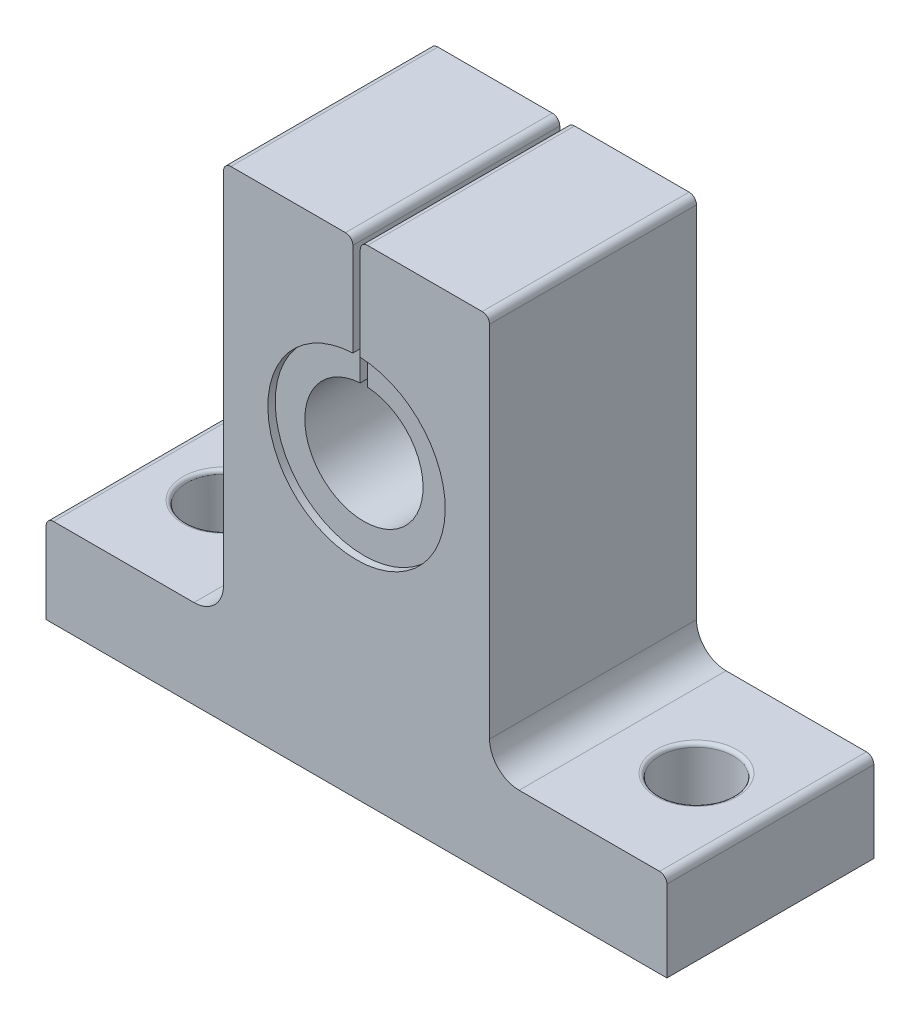
ISO-10303-21;
HEADER;
FILE_DESCRIPTION(('STEP AP214'),'2;1');
FILE_NAME('part.step','',(''),(''),'','','');
FILE_SCHEMA(('AUTOMOTIVE_DESIGN { 1 0 10303 214 1 1 1 1 }'));
ENDSEC;
DATA;
#1=APPLICATION_CONTEXT('core data for automotive mechanical design processes');
#2=APPLICATION_PROTOCOL_DEFINITION('international standard','automotive_design',2000,#1);
#3=PRODUCT_CONTEXT('',#1,'mechanical');
#4=PRODUCT('Part','Part','',(#3));
#5=PRODUCT_RELATED_PRODUCT_CATEGORY('part','',(#4));
#6=PRODUCT_DEFINITION_FORMATION('','',#4);
#7=PRODUCT_DEFINITION_CONTEXT('part definition',#1,'design');
#8=PRODUCT_DEFINITION('design','',#6,#7);
#9=PRODUCT_DEFINITION_SHAPE('','',#8);
#10=(LENGTH_UNIT() NAMED_UNIT(*) SI_UNIT(.MILLI.,.METRE.));
#11=(NAMED_UNIT(*) PLANE_ANGLE_UNIT() SI_UNIT($,.RADIAN.));
#12=(NAMED_UNIT(*) SI_UNIT($,.STERADIAN.) SOLID_ANGLE_UNIT());
#13=UNCERTAINTY_MEASURE_WITH_UNIT(LENGTH_MEASURE(1.E-05),#10,'distance_accuracy_value','');
#14=(GEOMETRIC_REPRESENTATION_CONTEXT(3) GLOBAL_UNCERTAINTY_ASSIGNED_CONTEXT((#13)) GLOBAL_UNIT_ASSIGNED_CONTEXT((#10,
#11,#12)) REPRESENTATION_CONTEXT('',''));
#15=CARTESIAN_POINT('',(0.,0.,0.));
#16=DIRECTION('',(0.,0.,1.));
#17=DIRECTION('',(1.,0.,0.));
#18=AXIS2_PLACEMENT_3D('',#15,#16,#17);
#19=CARTESIAN_POINT('',(-9.,32.8,14.));
#20=DIRECTION('',(0.,-1.,0.));
#21=DIRECTION('',(0.,0.,-1.));
#22=AXIS2_PLACEMENT_3D('',#19,#20,#21);
#23=PLANE('',#22);
#24=DIRECTION('',(-1.,0.,0.));
#25=VECTOR('',#24,1.);
#26=CARTESIAN_POINT('',(-9.,32.8,0.));
#27=LINE('',#26,#25);
#28=CARTESIAN_POINT('',(8.5,32.8,0.));
#29=VERTEX_POINT('',#28);
#30=CARTESIAN_POINT('',(0.750000000000004,32.8,0.));
#31=VERTEX_POINT('',#30);
#32=EDGE_CURVE('E441',#29,#31,#27,.T.);
#33=ORIENTED_EDGE('',*,*,#32,.T.);
#34=DIRECTION('',(0.,0.,-1.));
#35=VECTOR('',#34,1.);
#36=CARTESIAN_POINT('',(0.750000000000004,32.8,14.));
#37=LINE('',#36,#35);
#38=CARTESIAN_POINT('',(0.750000000000004,32.8,14.));
#39=VERTEX_POINT('',#38);
#40=EDGE_CURVE('E47',#31,#39,#37,.F.);
#41=ORIENTED_EDGE('',*,*,#40,.T.);
#42=DIRECTION('',(-1.,0.,0.));
#43=VECTOR('',#42,1.);
#44=CARTESIAN_POINT('',(-9.,32.8,14.));
#45=LINE('',#44,#43);
#46=CARTESIAN_POINT('',(8.5,32.8,14.));
#47=VERTEX_POINT('',#46);
#48=EDGE_CURVE('E366',#47,#39,#45,.T.);
#49=ORIENTED_EDGE('',*,*,#48,.F.);
#50=DIRECTION('',(0.,0.,-1.));
#51=VECTOR('',#50,1.);
#52=CARTESIAN_POINT('',(8.5,32.8,14.));
#53=LINE('',#52,#51);
#54=EDGE_CURVE('E307',#47,#29,#53,.T.);
#55=ORIENTED_EDGE('',*,*,#54,.T.);
#56=EDGE_LOOP('',(#33,#41,#49,#55));
#57=FACE_BOUND('',#56,.T.);
#58=ADVANCED_FACE('F32',(#57),#23,.F.);
#59=CARTESIAN_POINT('',(0.,20.,0.));
#60=DIRECTION('',(0.,0.,1.));
#61=DIRECTION('',(1.,0.,0.));
#62=AXIS2_PLACEMENT_3D('',#59,#60,#61);
#63=CYLINDRICAL_SURFACE('',#62,4.);
#64=CARTESIAN_POINT('',(0.,20.,13.5));
#65=DIRECTION('',(0.,0.,1.));
#66=DIRECTION('',(1.,0.,0.));
#67=AXIS2_PLACEMENT_3D('',#64,#65,#66);
#68=CIRCLE('',#67,4.);
#69=CARTESIAN_POINT('',(0.250000000000004,23.9921798556678,13.5));
#70=VERTEX_POINT('',#69);
#71=CARTESIAN_POINT('',(-0.25,23.9921798556678,13.5));
#72=VERTEX_POINT('',#71);
#73=EDGE_CURVE('E213',#70,#72,#68,.F.);
#74=ORIENTED_EDGE('',*,*,#73,.F.);
#75=DIRECTION('',(0.,0.,1.));
#76=VECTOR('',#75,1.);
#77=CARTESIAN_POINT('',(0.250000000000004,23.9921798556678,0.));
#78=LINE('',#77,#76);
#79=CARTESIAN_POINT('',(0.250000000000004,23.9921798556678,0.5));
#80=VERTEX_POINT('',#79);
#81=EDGE_CURVE('E216',#80,#70,#78,.T.);
#82=ORIENTED_EDGE('',*,*,#81,.F.);
#83=CARTESIAN_POINT('',(0.,20.,0.5));
#84=DIRECTION('',(0.,0.,-1.));
#85=DIRECTION('',(-1.,0.,0.));
#86=AXIS2_PLACEMENT_3D('',#83,#84,#85);
#87=CIRCLE('',#86,4.);
#88=CARTESIAN_POINT('',(-0.25,23.9921798556678,0.5));
#89=VERTEX_POINT('',#88);
#90=EDGE_CURVE('E215',#89,#80,#87,.F.);
#91=ORIENTED_EDGE('',*,*,#90,.F.);
#92=DIRECTION('',(0.,0.,1.));
#93=VECTOR('',#92,1.);
#94=CARTESIAN_POINT('',(-0.25,23.9921798556678,0.));
#95=LINE('',#94,#93);
#96=EDGE_CURVE('E198',#72,#89,#95,.F.);
#97=ORIENTED_EDGE('',*,*,#96,.F.);
#98=EDGE_LOOP('',(#74,#82,#91,#97));
#99=FACE_BOUND('',#98,.T.);
#100=ADVANCED_FACE('F211',(#99),#63,.F.);
#101=CARTESIAN_POINT('',(-21.,5.99999999999999,14.));
#102=DIRECTION('',(0.,-1.,0.));
#103=DIRECTION('',(0.,0.,-1.));
#104=AXIS2_PLACEMENT_3D('',#101,#102,#103);
#105=PLANE('',#104);
#106=CARTESIAN_POINT('',(-16.,5.99999999999999,7.));
#107=DIRECTION('',(0.,-1.,0.));
#108=DIRECTION('',(0.,0.,-1.));
#109=AXIS2_PLACEMENT_3D('',#106,#107,#108);
#110=CIRCLE('',#109,2.75);
#111=CARTESIAN_POINT('',(-16.,5.99999999999999,4.25));
#112=VERTEX_POINT('',#111);
#113=EDGE_CURVE('E11',#112,#112,#110,.T.);
#114=ORIENTED_EDGE('',*,*,#113,.T.);
#115=EDGE_LOOP('',(#114));
#116=FACE_BOUND('',#115,.T.);
#117=DIRECTION('',(-1.,0.,0.));
#118=VECTOR('',#117,1.);
#119=CARTESIAN_POINT('',(-21.,5.99999999999999,0.));
#120=LINE('',#119,#118);
#121=CARTESIAN_POINT('',(-11.,5.99999999999999,0.));
#122=VERTEX_POINT('',#121);
#123=CARTESIAN_POINT('',(-20.5,5.99999999999999,0.));
#124=VERTEX_POINT('',#123);
#125=EDGE_CURVE('E222',#122,#124,#120,.T.);
#126=ORIENTED_EDGE('',*,*,#125,.T.);
#127=DIRECTION('',(0.,0.,-1.));
#128=VECTOR('',#127,1.);
#129=CARTESIAN_POINT('',(-20.5,5.99999999999999,14.));
#130=LINE('',#129,#128);
#131=CARTESIAN_POINT('',(-20.5,5.99999999999999,14.));
#132=VERTEX_POINT('',#131);
#133=EDGE_CURVE('E279',#124,#132,#130,.F.);
#134=ORIENTED_EDGE('',*,*,#133,.T.);
#135=DIRECTION('',(-1.,0.,0.));
#136=VECTOR('',#135,1.);
#137=CARTESIAN_POINT('',(-21.,5.99999999999999,14.));
#138=LINE('',#137,#136);
#139=CARTESIAN_POINT('',(-11.,5.99999999999999,14.));
#140=VERTEX_POINT('',#139);
#141=EDGE_CURVE('E412',#140,#132,#138,.T.);
#142=ORIENTED_EDGE('',*,*,#141,.F.);
#143=DIRECTION('',(0.,0.,-1.));
#144=VECTOR('',#143,1.);
#145=CARTESIAN_POINT('',(-11.,5.99999999999999,0.));
#146=LINE('',#145,#144);
#147=EDGE_CURVE('E248',#140,#122,#146,.T.);
#148=ORIENTED_EDGE('',*,*,#147,.T.);
#149=EDGE_LOOP('',(#126,#134,#142,#148));
#150=FACE_BOUND('',#149,.T.);
#151=ADVANCED_FACE('F342',(#116,#150),#105,.F.);
#152=CARTESIAN_POINT('',(-21.,0.,14.));
#153=DIRECTION('',(1.,0.,0.));
#154=DIRECTION('',(0.,0.,-1.));
#155=AXIS2_PLACEMENT_3D('',#152,#153,#154);
#156=PLANE('',#155);
#157=DIRECTION('',(0.,-1.,0.));
#158=VECTOR('',#157,1.);
#159=CARTESIAN_POINT('',(-21.,0.,14.));
#160=LINE('',#159,#158);
#161=CARTESIAN_POINT('',(-21.,5.5,14.));
#162=VERTEX_POINT('',#161);
#163=CARTESIAN_POINT('',(-21.,0.,14.));
#164=VERTEX_POINT('',#163);
#165=EDGE_CURVE('E415',#162,#164,#160,.T.);
#166=ORIENTED_EDGE('',*,*,#165,.F.);
#167=DIRECTION('',(0.,0.,-1.));
#168=VECTOR('',#167,1.);
#169=CARTESIAN_POINT('',(-21.,5.5,14.));
#170=LINE('',#169,#168);
#171=CARTESIAN_POINT('',(-21.,5.5,0.));
#172=VERTEX_POINT('',#171);
#173=EDGE_CURVE('E264',#162,#172,#170,.T.);
#174=ORIENTED_EDGE('',*,*,#173,.T.);
#175=DIRECTION('',(0.,-1.,0.));
#176=VECTOR('',#175,1.);
#177=CARTESIAN_POINT('',(-21.,0.,0.));
#178=LINE('',#177,#176);
#179=CARTESIAN_POINT('',(-21.,0.,0.));
#180=VERTEX_POINT('',#179);
#181=EDGE_CURVE('E226',#172,#180,#178,.T.);
#182=ORIENTED_EDGE('',*,*,#181,.T.);
#183=DIRECTION('',(0.,0.,-1.));
#184=VECTOR('',#183,1.);
#185=CARTESIAN_POINT('',(-21.,0.,14.));
#186=LINE('',#185,#184);
#187=EDGE_CURVE('E232',#164,#180,#186,.T.);
#188=ORIENTED_EDGE('',*,*,#187,.F.);
#189=EDGE_LOOP('',(#166,#174,#182,#188));
#190=FACE_BOUND('',#189,.T.);
#191=ADVANCED_FACE('F568',(#190),#156,.F.);
#192=CARTESIAN_POINT('',(21.,0.,14.));
#193=DIRECTION('',(0.,1.,0.));
#194=DIRECTION('',(0.,0.,1.));
#195=AXIS2_PLACEMENT_3D('',#192,#193,#194);
#196=PLANE('',#195);
#197=CARTESIAN_POINT('',(16.,0.,7.));
#198=DIRECTION('',(0.,1.,0.));
#199=DIRECTION('',(0.,0.,-1.));
#200=AXIS2_PLACEMENT_3D('',#197,#198,#199);
#201=CIRCLE('',#200,2.5);
#202=CARTESIAN_POINT('',(16.,0.,4.5));
#203=VERTEX_POINT('',#202);
#204=EDGE_CURVE('E400',#203,#203,#201,.T.);
#205=ORIENTED_EDGE('',*,*,#204,.T.);
#206=EDGE_LOOP('',(#205));
#207=FACE_BOUND('',#206,.T.);
#208=CARTESIAN_POINT('',(-16.,0.,7.));
#209=DIRECTION('',(0.,1.,0.));
#210=DIRECTION('',(0.,0.,1.));
#211=AXIS2_PLACEMENT_3D('',#208,#209,#210);
#212=CIRCLE('',#211,2.5);
#213=CARTESIAN_POINT('',(-16.,0.,9.5));
#214=VERTEX_POINT('',#213);
#215=EDGE_CURVE('E403',#214,#214,#212,.T.);
#216=ORIENTED_EDGE('',*,*,#215,.T.);
#217=EDGE_LOOP('',(#216));
#218=FACE_BOUND('',#217,.T.);
#219=DIRECTION('',(1.,0.,0.));
#220=VECTOR('',#219,1.);
#221=CARTESIAN_POINT('',(21.,0.,0.));
#222=LINE('',#221,#220);
#223=CARTESIAN_POINT('',(21.,0.,0.));
#224=VERTEX_POINT('',#223);
#225=EDGE_CURVE('E430',#180,#224,#222,.T.);
#226=ORIENTED_EDGE('',*,*,#225,.T.);
#227=DIRECTION('',(0.,0.,-1.));
#228=VECTOR('',#227,1.);
#229=CARTESIAN_POINT('',(21.,0.,14.));
#230=LINE('',#229,#228);
#231=CARTESIAN_POINT('',(21.,0.,14.));
#232=VERTEX_POINT('',#231);
#233=EDGE_CURVE('E427',#232,#224,#230,.T.);
#234=ORIENTED_EDGE('',*,*,#233,.F.);
#235=DIRECTION('',(1.,0.,0.));
#236=VECTOR('',#235,1.);
#237=CARTESIAN_POINT('',(21.,0.,14.));
#238=LINE('',#237,#236);
#239=EDGE_CURVE('E418',#164,#232,#238,.T.);
#240=ORIENTED_EDGE('',*,*,#239,.F.);
#241=ORIENTED_EDGE('',*,*,#187,.T.);
#242=EDGE_LOOP('',(#226,#234,#240,#241));
#243=FACE_BOUND('',#242,.T.);
#244=ADVANCED_FACE('F452',(#207,#218,#243),#196,.F.);
#245=CARTESIAN_POINT('',(21.,0.,14.));
#246=DIRECTION('',(-1.,0.,0.));
#247=DIRECTION('',(0.,0.,1.));
#248=AXIS2_PLACEMENT_3D('',#245,#246,#247);
#249=PLANE('',#248);
#250=DIRECTION('',(0.,1.,0.));
#251=VECTOR('',#250,1.);
#252=CARTESIAN_POINT('',(21.,0.,0.));
#253=LINE('',#252,#251);
#254=CARTESIAN_POINT('',(21.,5.5,0.));
#255=VERTEX_POINT('',#254);
#256=EDGE_CURVE('E432',#224,#255,#253,.T.);
#257=ORIENTED_EDGE('',*,*,#256,.T.);
#258=DIRECTION('',(0.,0.,-1.));
#259=VECTOR('',#258,1.);
#260=CARTESIAN_POINT('',(21.,5.5,14.));
#261=LINE('',#260,#259);
#262=CARTESIAN_POINT('',(21.,5.5,14.));
#263=VERTEX_POINT('',#262);
#264=EDGE_CURVE('E295',#255,#263,#261,.F.);
#265=ORIENTED_EDGE('',*,*,#264,.T.);
#266=DIRECTION('',(0.,1.,0.));
#267=VECTOR('',#266,1.);
#268=CARTESIAN_POINT('',(21.,0.,14.));
#269=LINE('',#268,#267);
#270=EDGE_CURVE('E420',#232,#263,#269,.T.);
#271=ORIENTED_EDGE('',*,*,#270,.F.);
#272=ORIENTED_EDGE('',*,*,#233,.T.);
#273=EDGE_LOOP('',(#257,#265,#271,#272));
#274=FACE_BOUND('',#273,.T.);
#275=ADVANCED_FACE('F457',(#274),#249,.F.);
#276=CARTESIAN_POINT('',(21.,5.99999999999999,14.));
#277=DIRECTION('',(0.,-1.,0.));
#278=DIRECTION('',(0.,0.,-1.));
#279=AXIS2_PLACEMENT_3D('',#276,#277,#278);
#280=PLANE('',#279);
#281=CARTESIAN_POINT('',(16.,5.99999999999999,7.));
#282=DIRECTION('',(0.,-1.,0.));
#283=DIRECTION('',(0.,0.,-1.));
#284=AXIS2_PLACEMENT_3D('',#281,#282,#283);
#285=CIRCLE('',#284,2.75);
#286=CARTESIAN_POINT('',(16.,5.99999999999999,4.25));
#287=VERTEX_POINT('',#286);
#288=EDGE_CURVE('E319',#287,#287,#285,.T.);
#289=ORIENTED_EDGE('',*,*,#288,.T.);
#290=EDGE_LOOP('',(#289));
#291=FACE_BOUND('',#290,.T.);
#292=DIRECTION('',(-1.,0.,0.));
#293=VECTOR('',#292,1.);
#294=CARTESIAN_POINT('',(21.,5.99999999999999,14.));
#295=LINE('',#294,#293);
#296=CARTESIAN_POINT('',(20.5,5.99999999999999,14.));
#297=VERTEX_POINT('',#296);
#298=CARTESIAN_POINT('',(11.,5.99999999999999,14.));
#299=VERTEX_POINT('',#298);
#300=EDGE_CURVE('E423',#297,#299,#295,.T.);
#301=ORIENTED_EDGE('',*,*,#300,.F.);
#302=DIRECTION('',(0.,0.,-1.));
#303=VECTOR('',#302,1.);
#304=CARTESIAN_POINT('',(20.5,5.99999999999999,14.));
#305=LINE('',#304,#303);
#306=CARTESIAN_POINT('',(20.5,5.99999999999999,0.));
#307=VERTEX_POINT('',#306);
#308=EDGE_CURVE('E292',#297,#307,#305,.T.);
#309=ORIENTED_EDGE('',*,*,#308,.T.);
#310=DIRECTION('',(-1.,0.,0.));
#311=VECTOR('',#310,1.);
#312=CARTESIAN_POINT('',(21.,5.99999999999999,0.));
#313=LINE('',#312,#311);
#314=CARTESIAN_POINT('',(11.,5.99999999999999,0.));
#315=VERTEX_POINT('',#314);
#316=EDGE_CURVE('E435',#307,#315,#313,.T.);
#317=ORIENTED_EDGE('',*,*,#316,.T.);
#318=DIRECTION('',(0.,0.,-1.));
#319=VECTOR('',#318,1.);
#320=CARTESIAN_POINT('',(11.,5.99999999999999,14.));
#321=LINE('',#320,#319);
#322=EDGE_CURVE('E245',#315,#299,#321,.F.);
#323=ORIENTED_EDGE('',*,*,#322,.T.);
#324=EDGE_LOOP('',(#301,#309,#317,#323));
#325=FACE_BOUND('',#324,.T.);
#326=ADVANCED_FACE('F356',(#291,#325),#280,.F.);
#327=CARTESIAN_POINT('',(9.,5.99999999999999,14.));
#328=DIRECTION('',(-1.,0.,0.));
#329=DIRECTION('',(0.,0.,1.));
#330=AXIS2_PLACEMENT_3D('',#327,#328,#329);
#331=PLANE('',#330);
#332=DIRECTION('',(0.,1.,0.));
#333=VECTOR('',#332,1.);
#334=CARTESIAN_POINT('',(9.,5.99999999999999,0.));
#335=LINE('',#334,#333);
#336=CARTESIAN_POINT('',(9.,7.99999999999999,0.));
#337=VERTEX_POINT('',#336);
#338=CARTESIAN_POINT('',(9.,32.3,0.));
#339=VERTEX_POINT('',#338);
#340=EDGE_CURVE('E437',#337,#339,#335,.T.);
#341=ORIENTED_EDGE('',*,*,#340,.T.);
#342=DIRECTION('',(0.,0.,-1.));
#343=VECTOR('',#342,1.);
#344=CARTESIAN_POINT('',(9.,32.3,14.));
#345=LINE('',#344,#343);
#346=CARTESIAN_POINT('',(9.,32.3,14.));
#347=VERTEX_POINT('',#346);
#348=EDGE_CURVE('E314',#339,#347,#345,.F.);
#349=ORIENTED_EDGE('',*,*,#348,.T.);
#350=DIRECTION('',(0.,1.,0.));
#351=VECTOR('',#350,1.);
#352=CARTESIAN_POINT('',(9.,5.99999999999999,14.));
#353=LINE('',#352,#351);
#354=CARTESIAN_POINT('',(9.,7.99999999999999,14.));
#355=VERTEX_POINT('',#354);
#356=EDGE_CURVE('E367',#355,#347,#353,.T.);
#357=ORIENTED_EDGE('',*,*,#356,.F.);
#358=DIRECTION('',(0.,0.,-1.));
#359=VECTOR('',#358,1.);
#360=CARTESIAN_POINT('',(9.,7.99999999999999,0.));
#361=LINE('',#360,#359);
#362=EDGE_CURVE('E242',#355,#337,#361,.T.);
#363=ORIENTED_EDGE('',*,*,#362,.T.);
#364=EDGE_LOOP('',(#341,#349,#357,#363));
#365=FACE_BOUND('',#364,.T.);
#366=ADVANCED_FACE('F348',(#365),#331,.F.);
#367=CARTESIAN_POINT('',(-0.750000000000001,32.8,14.));
#368=VERTEX_POINT('',#367);
#369=CARTESIAN_POINT('',(-8.5,32.8,14.));
#370=VERTEX_POINT('',#369);
#371=EDGE_CURVE('E360',#368,#370,#45,.T.);
#372=ORIENTED_EDGE('',*,*,#371,.F.);
#373=DIRECTION('',(0.,0.,1.));
#374=VECTOR('',#373,1.);
#375=CARTESIAN_POINT('',(-0.750000000000001,32.8,14.));
#376=LINE('',#375,#374);
#377=CARTESIAN_POINT('',(-0.750000000000001,32.8,0.));
#378=VERTEX_POINT('',#377);
#379=EDGE_CURVE('E302',#368,#378,#376,.F.);
#380=ORIENTED_EDGE('',*,*,#379,.T.);
#381=CARTESIAN_POINT('',(-8.5,32.8,0.));
#382=VERTEX_POINT('',#381);
#383=EDGE_CURVE('E380',#378,#382,#27,.T.);
#384=ORIENTED_EDGE('',*,*,#383,.T.);
#385=DIRECTION('',(0.,0.,-1.));
#386=VECTOR('',#385,1.);
#387=CARTESIAN_POINT('',(-8.5,32.8,14.));
#388=LINE('',#387,#386);
#389=EDGE_CURVE('E300',#382,#370,#388,.F.);
#390=ORIENTED_EDGE('',*,*,#389,.T.);
#391=EDGE_LOOP('',(#372,#380,#384,#390));
#392=FACE_BOUND('',#391,.T.);
#393=ADVANCED_FACE('F338',(#392),#23,.F.);
#394=CARTESIAN_POINT('',(-9.,5.99999999999999,14.));
#395=DIRECTION('',(1.,0.,0.));
#396=DIRECTION('',(0.,0.,-1.));
#397=AXIS2_PLACEMENT_3D('',#394,#395,#396);
#398=PLANE('',#397);
#399=DIRECTION('',(0.,-1.,0.));
#400=VECTOR('',#399,1.);
#401=CARTESIAN_POINT('',(-9.,5.99999999999999,14.));
#402=LINE('',#401,#400);
#403=CARTESIAN_POINT('',(-9.,32.3,14.));
#404=VERTEX_POINT('',#403);
#405=CARTESIAN_POINT('',(-9.,7.99999999999999,14.));
#406=VERTEX_POINT('',#405);
#407=EDGE_CURVE('E426',#404,#406,#402,.T.);
#408=ORIENTED_EDGE('',*,*,#407,.F.);
#409=DIRECTION('',(0.,0.,-1.));
#410=VECTOR('',#409,1.);
#411=CARTESIAN_POINT('',(-9.,32.3,14.));
#412=LINE('',#411,#410);
#413=CARTESIAN_POINT('',(-9.,32.3,0.));
#414=VERTEX_POINT('',#413);
#415=EDGE_CURVE('E311',#404,#414,#412,.T.);
#416=ORIENTED_EDGE('',*,*,#415,.T.);
#417=DIRECTION('',(0.,-1.,0.));
#418=VECTOR('',#417,1.);
#419=CARTESIAN_POINT('',(-9.,5.99999999999999,0.));
#420=LINE('',#419,#418);
#421=CARTESIAN_POINT('',(-9.,7.99999999999999,0.));
#422=VERTEX_POINT('',#421);
#423=EDGE_CURVE('E416',#414,#422,#420,.T.);
#424=ORIENTED_EDGE('',*,*,#423,.T.);
#425=DIRECTION('',(0.,0.,-1.));
#426=VECTOR('',#425,1.);
#427=CARTESIAN_POINT('',(-9.,7.99999999999999,14.));
#428=LINE('',#427,#426);
#429=EDGE_CURVE('E251',#422,#406,#428,.F.);
#430=ORIENTED_EDGE('',*,*,#429,.T.);
#431=EDGE_LOOP('',(#408,#416,#424,#430));
#432=FACE_BOUND('',#431,.T.);
#433=ADVANCED_FACE('F347',(#432),#398,.F.);
#434=CARTESIAN_POINT('',(0.,0.,14.));
#435=DIRECTION('',(0.,0.,1.));
#436=DIRECTION('',(1.,0.,0.));
#437=AXIS2_PLACEMENT_3D('',#434,#435,#436);
#438=PLANE('',#437);
#439=ORIENTED_EDGE('',*,*,#141,.T.);
#440=CARTESIAN_POINT('',(-20.5,5.5,14.));
#441=DIRECTION('',(0.,0.,1.));
#442=DIRECTION('',(1.,0.,0.));
#443=AXIS2_PLACEMENT_3D('',#440,#441,#442);
#444=CIRCLE('',#443,0.5);
#445=EDGE_CURVE('E290',#132,#162,#444,.T.);
#446=ORIENTED_EDGE('',*,*,#445,.T.);
#447=ORIENTED_EDGE('',*,*,#165,.T.);
#448=ORIENTED_EDGE('',*,*,#239,.T.);
#449=ORIENTED_EDGE('',*,*,#270,.T.);
#450=CARTESIAN_POINT('',(20.5,5.5,14.));
#451=DIRECTION('',(0.,0.,1.));
#452=DIRECTION('',(1.,0.,0.));
#453=AXIS2_PLACEMENT_3D('',#450,#451,#452);
#454=CIRCLE('',#453,0.5);
#455=EDGE_CURVE('E288',#263,#297,#454,.T.);
#456=ORIENTED_EDGE('',*,*,#455,.T.);
#457=ORIENTED_EDGE('',*,*,#300,.T.);
#458=CARTESIAN_POINT('',(11.,7.99999999999999,14.));
#459=DIRECTION('',(0.,0.,1.));
#460=DIRECTION('',(1.,0.,0.));
#461=AXIS2_PLACEMENT_3D('',#458,#459,#460);
#462=CIRCLE('',#461,2.);
#463=EDGE_CURVE('E257',#299,#355,#462,.F.);
#464=ORIENTED_EDGE('',*,*,#463,.T.);
#465=ORIENTED_EDGE('',*,*,#356,.T.);
#466=CARTESIAN_POINT('',(8.5,32.3,14.));
#467=DIRECTION('',(0.,0.,1.));
#468=DIRECTION('',(1.,0.,0.));
#469=AXIS2_PLACEMENT_3D('',#466,#467,#468);
#470=CIRCLE('',#469,0.5);
#471=EDGE_CURVE('E54',#347,#47,#470,.T.);
#472=ORIENTED_EDGE('',*,*,#471,.T.);
#473=ORIENTED_EDGE('',*,*,#48,.T.);
#474=CARTESIAN_POINT('',(0.750000000000004,32.3,14.));
#475=DIRECTION('',(0.,0.,1.));
#476=DIRECTION('',(1.,0.,0.));
#477=AXIS2_PLACEMENT_3D('',#474,#475,#476);
#478=CIRCLE('',#477,0.5);
#479=CARTESIAN_POINT('',(0.250000000000004,32.3,14.));
#480=VERTEX_POINT('',#479);
#481=EDGE_CURVE('E284',#39,#480,#478,.T.);
#482=ORIENTED_EDGE('',*,*,#481,.T.);
#483=DIRECTION('',(0.,1.,0.));
#484=VECTOR('',#483,1.);
#485=CARTESIAN_POINT('',(0.250000000000004,-0.00100000000000794,14.));
#486=LINE('',#485,#484);
#487=CARTESIAN_POINT('',(0.250000000000004,25.9947894041409,14.));
#488=VERTEX_POINT('',#487);
#489=EDGE_CURVE('E385',#488,#480,#486,.T.);
#490=ORIENTED_EDGE('',*,*,#489,.F.);
#491=CARTESIAN_POINT('',(0.,20.,14.));
#492=DIRECTION('',(0.,0.,1.));
#493=DIRECTION('',(1.,0.,0.));
#494=AXIS2_PLACEMENT_3D('',#491,#492,#493);
#495=CIRCLE('',#494,6.);
#496=CARTESIAN_POINT('',(-0.25,25.9947894041409,14.));
#497=VERTEX_POINT('',#496);
#498=EDGE_CURVE('E228',#497,#488,#495,.T.);
#499=ORIENTED_EDGE('',*,*,#498,.F.);
#500=DIRECTION('',(0.,1.,0.));
#501=VECTOR('',#500,1.);
#502=CARTESIAN_POINT('',(-0.25,-0.00100000000000794,14.));
#503=LINE('',#502,#501);
#504=CARTESIAN_POINT('',(-0.25,32.3,14.));
#505=VERTEX_POINT('',#504);
#506=EDGE_CURVE('E217',#497,#505,#503,.T.);
#507=ORIENTED_EDGE('',*,*,#506,.T.);
#508=CARTESIAN_POINT('',(-0.75,32.3,14.));
#509=DIRECTION('',(0.,0.,1.));
#510=DIRECTION('',(1.,0.,0.));
#511=AXIS2_PLACEMENT_3D('',#508,#509,#510);
#512=CIRCLE('',#511,0.5);
#513=EDGE_CURVE('E286',#505,#368,#512,.T.);
#514=ORIENTED_EDGE('',*,*,#513,.T.);
#515=ORIENTED_EDGE('',*,*,#371,.T.);
#516=CARTESIAN_POINT('',(-8.5,32.3,14.));
#517=DIRECTION('',(0.,0.,1.));
#518=DIRECTION('',(1.,0.,0.));
#519=AXIS2_PLACEMENT_3D('',#516,#517,#518);
#520=CIRCLE('',#519,0.5);
#521=EDGE_CURVE('E282',#370,#404,#520,.T.);
#522=ORIENTED_EDGE('',*,*,#521,.T.);
#523=ORIENTED_EDGE('',*,*,#407,.T.);
#524=CARTESIAN_POINT('',(-11.,7.99999999999999,14.));
#525=DIRECTION('',(0.,0.,1.));
#526=DIRECTION('',(1.,0.,0.));
#527=AXIS2_PLACEMENT_3D('',#524,#525,#526);
#528=CIRCLE('',#527,2.);
#529=EDGE_CURVE('E262',#406,#140,#528,.F.);
#530=ORIENTED_EDGE('',*,*,#529,.T.);
#531=EDGE_LOOP('',(#439,#446,#447,#448,#449,#456,#457,#464,#465,#472,#473,#482,#490,#499,#507,
#514,#515,#522,#523,#530));
#532=FACE_BOUND('',#531,.T.);
#533=ADVANCED_FACE('F354',(#532),#438,.T.);
#534=CARTESIAN_POINT('',(0.,0.,0.));
#535=DIRECTION('',(0.,0.,1.));
#536=DIRECTION('',(1.,0.,0.));
#537=AXIS2_PLACEMENT_3D('',#534,#535,#536);
#538=PLANE('',#537);
#539=ORIENTED_EDGE('',*,*,#181,.F.);
#540=CARTESIAN_POINT('',(-20.5,5.5,0.));
#541=DIRECTION('',(0.,0.,1.));
#542=DIRECTION('',(1.,0.,0.));
#543=AXIS2_PLACEMENT_3D('',#540,#541,#542);
#544=CIRCLE('',#543,0.5);
#545=EDGE_CURVE('E277',#172,#124,#544,.F.);
#546=ORIENTED_EDGE('',*,*,#545,.T.);
#547=ORIENTED_EDGE('',*,*,#125,.F.);
#548=CARTESIAN_POINT('',(-11.,7.99999999999999,0.));
#549=DIRECTION('',(0.,0.,1.));
#550=DIRECTION('',(1.,0.,0.));
#551=AXIS2_PLACEMENT_3D('',#548,#549,#550);
#552=CIRCLE('',#551,2.);
#553=EDGE_CURVE('E259',#122,#422,#552,.T.);
#554=ORIENTED_EDGE('',*,*,#553,.T.);
#555=ORIENTED_EDGE('',*,*,#423,.F.);
#556=CARTESIAN_POINT('',(-8.5,32.3,0.));
#557=DIRECTION('',(0.,0.,1.));
#558=DIRECTION('',(1.,0.,0.));
#559=AXIS2_PLACEMENT_3D('',#556,#557,#558);
#560=CIRCLE('',#559,0.5);
#561=EDGE_CURVE('E269',#414,#382,#560,.F.);
#562=ORIENTED_EDGE('',*,*,#561,.T.);
#563=ORIENTED_EDGE('',*,*,#383,.F.);
#564=CARTESIAN_POINT('',(-0.75,32.3,0.));
#565=DIRECTION('',(0.,0.,1.));
#566=DIRECTION('',(1.,0.,0.));
#567=AXIS2_PLACEMENT_3D('',#564,#565,#566);
#568=CIRCLE('',#567,0.5);
#569=CARTESIAN_POINT('',(-0.25,32.3,0.));
#570=VERTEX_POINT('',#569);
#571=EDGE_CURVE('E273',#378,#570,#568,.F.);
#572=ORIENTED_EDGE('',*,*,#571,.T.);
#573=DIRECTION('',(0.,1.,0.));
#574=VECTOR('',#573,1.);
#575=CARTESIAN_POINT('',(-0.25,-0.00100000000000794,0.));
#576=LINE('',#575,#574);
#577=CARTESIAN_POINT('',(-0.25,25.9947894041409,0.));
#578=VERTEX_POINT('',#577);
#579=EDGE_CURVE('E378',#578,#570,#576,.T.);
#580=ORIENTED_EDGE('',*,*,#579,.F.);
#581=CARTESIAN_POINT('',(0.,20.,0.));
#582=DIRECTION('',(0.,0.,-1.));
#583=DIRECTION('',(-1.,0.,0.));
#584=AXIS2_PLACEMENT_3D('',#581,#582,#583);
#585=CIRCLE('',#584,6.);
#586=CARTESIAN_POINT('',(0.250000000000004,25.9947894041409,0.));
#587=VERTEX_POINT('',#586);
#588=EDGE_CURVE('E406',#587,#578,#585,.T.);
#589=ORIENTED_EDGE('',*,*,#588,.F.);
#590=DIRECTION('',(0.,1.,0.));
#591=VECTOR('',#590,1.);
#592=CARTESIAN_POINT('',(0.250000000000004,-0.00100000000000794,0.));
#593=LINE('',#592,#591);
#594=CARTESIAN_POINT('',(0.250000000000004,32.3,0.));
#595=VERTEX_POINT('',#594);
#596=EDGE_CURVE('E382',#587,#595,#593,.T.);
#597=ORIENTED_EDGE('',*,*,#596,.T.);
#598=CARTESIAN_POINT('',(0.750000000000004,32.3,0.));
#599=DIRECTION('',(0.,0.,1.));
#600=DIRECTION('',(1.,0.,0.));
#601=AXIS2_PLACEMENT_3D('',#598,#599,#600);
#602=CIRCLE('',#601,0.5);
#603=EDGE_CURVE('E271',#595,#31,#602,.F.);
#604=ORIENTED_EDGE('',*,*,#603,.T.);
#605=ORIENTED_EDGE('',*,*,#32,.F.);
#606=CARTESIAN_POINT('',(8.5,32.3,0.));
#607=DIRECTION('',(0.,0.,1.));
#608=DIRECTION('',(1.,0.,0.));
#609=AXIS2_PLACEMENT_3D('',#606,#607,#608);
#610=CIRCLE('',#609,0.5);
#611=EDGE_CURVE('E267',#29,#339,#610,.F.);
#612=ORIENTED_EDGE('',*,*,#611,.T.);
#613=ORIENTED_EDGE('',*,*,#340,.F.);
#614=CARTESIAN_POINT('',(11.,7.99999999999999,0.));
#615=DIRECTION('',(0.,0.,1.));
#616=DIRECTION('',(1.,0.,0.));
#617=AXIS2_PLACEMENT_3D('',#614,#615,#616);
#618=CIRCLE('',#617,2.);
#619=EDGE_CURVE('E254',#337,#315,#618,.T.);
#620=ORIENTED_EDGE('',*,*,#619,.T.);
#621=ORIENTED_EDGE('',*,*,#316,.F.);
#622=CARTESIAN_POINT('',(20.5,5.5,0.));
#623=DIRECTION('',(0.,0.,1.));
#624=DIRECTION('',(1.,0.,0.));
#625=AXIS2_PLACEMENT_3D('',#622,#623,#624);
#626=CIRCLE('',#625,0.5);
#627=EDGE_CURVE('E275',#307,#255,#626,.F.);
#628=ORIENTED_EDGE('',*,*,#627,.T.);
#629=ORIENTED_EDGE('',*,*,#256,.F.);
#630=ORIENTED_EDGE('',*,*,#225,.F.);
#631=EDGE_LOOP('',(#539,#546,#547,#554,#555,#562,#563,#572,#580,#589,#597,#604,#605,#612,#613,
#620,#621,#628,#629,#630));
#632=FACE_BOUND('',#631,.T.);
#633=ADVANCED_FACE('F376',(#632),#538,.F.);
#634=CARTESIAN_POINT('',(0.,20.,13.5));
#635=DIRECTION('',(0.,0.,1.));
#636=DIRECTION('',(1.,0.,0.));
#637=AXIS2_PLACEMENT_3D('',#634,#635,#636);
#638=PLANE('',#637);
#639=DIRECTION('',(0.,1.,0.));
#640=VECTOR('',#639,1.);
#641=CARTESIAN_POINT('',(0.250000000000004,20.,13.5));
#642=LINE('',#641,#640);
#643=CARTESIAN_POINT('',(0.250000000000004,25.9947894041409,13.5));
#644=VERTEX_POINT('',#643);
#645=EDGE_CURVE('E221',#70,#644,#642,.T.);
#646=ORIENTED_EDGE('',*,*,#645,.F.);
#647=ORIENTED_EDGE('',*,*,#73,.T.);
#648=DIRECTION('',(0.,-1.,0.));
#649=VECTOR('',#648,1.);
#650=CARTESIAN_POINT('',(-0.25,20.,13.5));
#651=LINE('',#650,#649);
#652=CARTESIAN_POINT('',(-0.25,25.9947894041409,13.5));
#653=VERTEX_POINT('',#652);
#654=EDGE_CURVE('E194',#653,#72,#651,.T.);
#655=ORIENTED_EDGE('',*,*,#654,.F.);
#656=CARTESIAN_POINT('',(0.,20.,13.5));
#657=DIRECTION('',(0.,0.,1.));
#658=DIRECTION('',(1.,0.,0.));
#659=AXIS2_PLACEMENT_3D('',#656,#657,#658);
#660=CIRCLE('',#659,6.);
#661=EDGE_CURVE('E223',#653,#644,#660,.T.);
#662=ORIENTED_EDGE('',*,*,#661,.T.);
#663=EDGE_LOOP('',(#646,#647,#655,#662));
#664=FACE_BOUND('',#663,.T.);
#665=ADVANCED_FACE('F220',(#664),#638,.T.);
#666=CARTESIAN_POINT('',(0.,20.,13.5));
#667=DIRECTION('',(0.,0.,1.));
#668=DIRECTION('',(1.,0.,0.));
#669=AXIS2_PLACEMENT_3D('',#666,#667,#668);
#670=CYLINDRICAL_SURFACE('',#669,6.);
#671=ORIENTED_EDGE('',*,*,#498,.T.);
#672=DIRECTION('',(0.,0.,1.));
#673=VECTOR('',#672,1.);
#674=CARTESIAN_POINT('',(0.250000000000004,25.9947894041409,13.5));
#675=LINE('',#674,#673);
#676=EDGE_CURVE('E396',#488,#644,#675,.F.);
#677=ORIENTED_EDGE('',*,*,#676,.T.);
#678=ORIENTED_EDGE('',*,*,#661,.F.);
#679=DIRECTION('',(0.,0.,1.));
#680=VECTOR('',#679,1.);
#681=CARTESIAN_POINT('',(-0.25,25.9947894041409,13.5));
#682=LINE('',#681,#680);
#683=EDGE_CURVE('E201',#653,#497,#682,.T.);
#684=ORIENTED_EDGE('',*,*,#683,.T.);
#685=EDGE_LOOP('',(#671,#677,#678,#684));
#686=FACE_BOUND('',#685,.T.);
#687=ADVANCED_FACE('F484',(#686),#670,.F.);
#688=CARTESIAN_POINT('',(0.,20.,0.5));
#689=DIRECTION('',(0.,0.,-1.));
#690=DIRECTION('',(-1.,0.,0.));
#691=AXIS2_PLACEMENT_3D('',#688,#689,#690);
#692=PLANE('',#691);
#693=DIRECTION('',(0.,-1.,0.));
#694=VECTOR('',#693,1.);
#695=CARTESIAN_POINT('',(0.250000000000004,20.,0.5));
#696=LINE('',#695,#694);
#697=CARTESIAN_POINT('',(0.250000000000004,25.9947894041409,0.5));
#698=VERTEX_POINT('',#697);
#699=EDGE_CURVE('E206',#698,#80,#696,.T.);
#700=ORIENTED_EDGE('',*,*,#699,.F.);
#701=CARTESIAN_POINT('',(0.,20.,0.5));
#702=DIRECTION('',(0.,0.,-1.));
#703=DIRECTION('',(-1.,0.,0.));
#704=AXIS2_PLACEMENT_3D('',#701,#702,#703);
#705=CIRCLE('',#704,6.);
#706=CARTESIAN_POINT('',(-0.25,25.9947894041409,0.5));
#707=VERTEX_POINT('',#706);
#708=EDGE_CURVE('E235',#698,#707,#705,.T.);
#709=ORIENTED_EDGE('',*,*,#708,.T.);
#710=DIRECTION('',(0.,1.,0.));
#711=VECTOR('',#710,1.);
#712=CARTESIAN_POINT('',(-0.25,20.,0.5));
#713=LINE('',#712,#711);
#714=EDGE_CURVE('E391',#89,#707,#713,.T.);
#715=ORIENTED_EDGE('',*,*,#714,.F.);
#716=ORIENTED_EDGE('',*,*,#90,.T.);
#717=EDGE_LOOP('',(#700,#709,#715,#716));
#718=FACE_BOUND('',#717,.T.);
#719=ADVANCED_FACE('F486',(#718),#692,.T.);
#720=CARTESIAN_POINT('',(0.,20.,0.5));
#721=DIRECTION('',(0.,0.,-1.));
#722=DIRECTION('',(-1.,0.,0.));
#723=AXIS2_PLACEMENT_3D('',#720,#721,#722);
#724=CYLINDRICAL_SURFACE('',#723,6.);
#725=ORIENTED_EDGE('',*,*,#708,.F.);
#726=DIRECTION('',(0.,0.,-1.));
#727=VECTOR('',#726,1.);
#728=CARTESIAN_POINT('',(0.250000000000004,25.9947894041409,0.5));
#729=LINE('',#728,#727);
#730=EDGE_CURVE('E239',#698,#587,#729,.T.);
#731=ORIENTED_EDGE('',*,*,#730,.T.);
#732=ORIENTED_EDGE('',*,*,#588,.T.);
#733=DIRECTION('',(0.,0.,-1.));
#734=VECTOR('',#733,1.);
#735=CARTESIAN_POINT('',(-0.25,25.9947894041409,0.5));
#736=LINE('',#735,#734);
#737=EDGE_CURVE('E236',#578,#707,#736,.F.);
#738=ORIENTED_EDGE('',*,*,#737,.T.);
#739=EDGE_LOOP('',(#725,#731,#732,#738));
#740=FACE_BOUND('',#739,.T.);
#741=ADVANCED_FACE('F492',(#740),#724,.F.);
#742=CARTESIAN_POINT('',(-16.,0.,7.));
#743=DIRECTION('',(0.,1.,0.));
#744=DIRECTION('',(0.,0.,1.));
#745=AXIS2_PLACEMENT_3D('',#742,#743,#744);
#746=CYLINDRICAL_SURFACE('',#745,2.5);
#747=CARTESIAN_POINT('',(-16.,5.74999999999999,7.));
#748=DIRECTION('',(0.,-1.,0.));
#749=DIRECTION('',(0.,0.,-1.));
#750=AXIS2_PLACEMENT_3D('',#747,#748,#749);
#751=CIRCLE('',#750,2.5);
#752=CARTESIAN_POINT('',(-16.,5.74999999999999,4.5));
#753=VERTEX_POINT('',#752);
#754=EDGE_CURVE('E40',#753,#753,#751,.F.);
#755=ORIENTED_EDGE('',*,*,#754,.T.);
#756=EDGE_LOOP('',(#755));
#757=FACE_BOUND('',#756,.T.);
#758=ORIENTED_EDGE('',*,*,#215,.F.);
#759=EDGE_LOOP('',(#758));
#760=FACE_BOUND('',#759,.T.);
#761=ADVANCED_FACE('F324',(#757,#760),#746,.F.);
#762=CARTESIAN_POINT('',(16.,0.,7.));
#763=DIRECTION('',(0.,1.,0.));
#764=DIRECTION('',(0.,0.,1.));
#765=AXIS2_PLACEMENT_3D('',#762,#763,#764);
#766=CYLINDRICAL_SURFACE('',#765,2.5);
#767=CARTESIAN_POINT('',(16.,5.74999999999999,7.));
#768=DIRECTION('',(0.,-1.,0.));
#769=DIRECTION('',(0.,0.,-1.));
#770=AXIS2_PLACEMENT_3D('',#767,#768,#769);
#771=CIRCLE('',#770,2.5);
#772=CARTESIAN_POINT('',(16.,5.74999999999999,4.5));
#773=VERTEX_POINT('',#772);
#774=EDGE_CURVE('E316',#773,#773,#771,.F.);
#775=ORIENTED_EDGE('',*,*,#774,.T.);
#776=EDGE_LOOP('',(#775));
#777=FACE_BOUND('',#776,.T.);
#778=ORIENTED_EDGE('',*,*,#204,.F.);
#779=EDGE_LOOP('',(#778));
#780=FACE_BOUND('',#779,.T.);
#781=ADVANCED_FACE('F625',(#777,#780),#766,.F.);
#782=CARTESIAN_POINT('',(-0.25,-0.00100000000000794,14.));
#783=DIRECTION('',(-1.,0.,0.));
#784=DIRECTION('',(0.,0.,1.));
#785=AXIS2_PLACEMENT_3D('',#782,#783,#784);
#786=PLANE('',#785);
#787=ORIENTED_EDGE('',*,*,#579,.T.);
#788=DIRECTION('',(0.,0.,1.));
#789=VECTOR('',#788,1.);
#790=CARTESIAN_POINT('',(-0.25,32.3,14.));
#791=LINE('',#790,#789);
#792=EDGE_CURVE('E297',#570,#505,#791,.T.);
#793=ORIENTED_EDGE('',*,*,#792,.T.);
#794=ORIENTED_EDGE('',*,*,#506,.F.);
#795=ORIENTED_EDGE('',*,*,#683,.F.);
#796=ORIENTED_EDGE('',*,*,#654,.T.);
#797=ORIENTED_EDGE('',*,*,#96,.T.);
#798=ORIENTED_EDGE('',*,*,#714,.T.);
#799=ORIENTED_EDGE('',*,*,#737,.F.);
#800=EDGE_LOOP('',(#787,#793,#794,#795,#796,#797,#798,#799));
#801=FACE_BOUND('',#800,.T.);
#802=ADVANCED_FACE('F197',(#801),#786,.F.);
#803=CARTESIAN_POINT('',(0.250000000000004,-0.00100000000000794,14.));
#804=DIRECTION('',(1.,0.,0.));
#805=DIRECTION('',(0.,0.,-1.));
#806=AXIS2_PLACEMENT_3D('',#803,#804,#805);
#807=PLANE('',#806);
#808=ORIENTED_EDGE('',*,*,#489,.T.);
#809=DIRECTION('',(0.,0.,-1.));
#810=VECTOR('',#809,1.);
#811=CARTESIAN_POINT('',(0.250000000000004,32.3,14.));
#812=LINE('',#811,#810);
#813=EDGE_CURVE('E304',#480,#595,#812,.T.);
#814=ORIENTED_EDGE('',*,*,#813,.T.);
#815=ORIENTED_EDGE('',*,*,#596,.F.);
#816=ORIENTED_EDGE('',*,*,#730,.F.);
#817=ORIENTED_EDGE('',*,*,#699,.T.);
#818=ORIENTED_EDGE('',*,*,#81,.T.);
#819=ORIENTED_EDGE('',*,*,#645,.T.);
#820=ORIENTED_EDGE('',*,*,#676,.F.);
#821=EDGE_LOOP('',(#808,#814,#815,#816,#817,#818,#819,#820));
#822=FACE_BOUND('',#821,.T.);
#823=ADVANCED_FACE('F480',(#822),#807,.F.);
#824=CARTESIAN_POINT('',(11.,7.99999999999999,14.));
#825=DIRECTION('',(0.,0.,1.));
#826=DIRECTION('',(1.,0.,0.));
#827=AXIS2_PLACEMENT_3D('',#824,#825,#826);
#828=CYLINDRICAL_SURFACE('',#827,2.);
#829=ORIENTED_EDGE('',*,*,#463,.F.);
#830=ORIENTED_EDGE('',*,*,#322,.F.);
#831=ORIENTED_EDGE('',*,*,#619,.F.);
#832=ORIENTED_EDGE('',*,*,#362,.F.);
#833=EDGE_LOOP('',(#829,#830,#831,#832));
#834=FACE_BOUND('',#833,.T.);
#835=ADVANCED_FACE('F468',(#834),#828,.F.);
#836=CARTESIAN_POINT('',(-11.,7.99999999999999,14.));
#837=DIRECTION('',(0.,0.,1.));
#838=DIRECTION('',(1.,0.,0.));
#839=AXIS2_PLACEMENT_3D('',#836,#837,#838);
#840=CYLINDRICAL_SURFACE('',#839,2.);
#841=ORIENTED_EDGE('',*,*,#529,.F.);
#842=ORIENTED_EDGE('',*,*,#429,.F.);
#843=ORIENTED_EDGE('',*,*,#553,.F.);
#844=ORIENTED_EDGE('',*,*,#147,.F.);
#845=EDGE_LOOP('',(#841,#842,#843,#844));
#846=FACE_BOUND('',#845,.T.);
#847=ADVANCED_FACE('F543',(#846),#840,.F.);
#848=CARTESIAN_POINT('',(-20.5,5.5,14.));
#849=DIRECTION('',(0.,0.,-1.));
#850=DIRECTION('',(-1.,0.,0.));
#851=AXIS2_PLACEMENT_3D('',#848,#849,#850);
#852=CYLINDRICAL_SURFACE('',#851,0.5);
#853=ORIENTED_EDGE('',*,*,#445,.F.);
#854=ORIENTED_EDGE('',*,*,#133,.F.);
#855=ORIENTED_EDGE('',*,*,#545,.F.);
#856=ORIENTED_EDGE('',*,*,#173,.F.);
#857=EDGE_LOOP('',(#853,#854,#855,#856));
#858=FACE_BOUND('',#857,.T.);
#859=ADVANCED_FACE('F553',(#858),#852,.T.);
#860=CARTESIAN_POINT('',(20.5,5.5,14.));
#861=DIRECTION('',(0.,0.,-1.));
#862=DIRECTION('',(-1.,0.,0.));
#863=AXIS2_PLACEMENT_3D('',#860,#861,#862);
#864=CYLINDRICAL_SURFACE('',#863,0.5);
#865=ORIENTED_EDGE('',*,*,#455,.F.);
#866=ORIENTED_EDGE('',*,*,#264,.F.);
#867=ORIENTED_EDGE('',*,*,#627,.F.);
#868=ORIENTED_EDGE('',*,*,#308,.F.);
#869=EDGE_LOOP('',(#865,#866,#867,#868));
#870=FACE_BOUND('',#869,.T.);
#871=ADVANCED_FACE('F460',(#870),#864,.T.);
#872=CARTESIAN_POINT('',(-0.75,32.3,14.));
#873=DIRECTION('',(0.,0.,1.));
#874=DIRECTION('',(1.,0.,0.));
#875=AXIS2_PLACEMENT_3D('',#872,#873,#874);
#876=CYLINDRICAL_SURFACE('',#875,0.5);
#877=ORIENTED_EDGE('',*,*,#571,.F.);
#878=ORIENTED_EDGE('',*,*,#379,.F.);
#879=ORIENTED_EDGE('',*,*,#513,.F.);
#880=ORIENTED_EDGE('',*,*,#792,.F.);
#881=EDGE_LOOP('',(#877,#878,#879,#880));
#882=FACE_BOUND('',#881,.T.);
#883=ADVANCED_FACE('F371',(#882),#876,.T.);
#884=CARTESIAN_POINT('',(0.750000000000004,32.3,14.));
#885=DIRECTION('',(0.,0.,-1.));
#886=DIRECTION('',(-1.,0.,0.));
#887=AXIS2_PLACEMENT_3D('',#884,#885,#886);
#888=CYLINDRICAL_SURFACE('',#887,0.5);
#889=ORIENTED_EDGE('',*,*,#481,.F.);
#890=ORIENTED_EDGE('',*,*,#40,.F.);
#891=ORIENTED_EDGE('',*,*,#603,.F.);
#892=ORIENTED_EDGE('',*,*,#813,.F.);
#893=EDGE_LOOP('',(#889,#890,#891,#892));
#894=FACE_BOUND('',#893,.T.);
#895=ADVANCED_FACE('F478',(#894),#888,.T.);
#896=CARTESIAN_POINT('',(-8.5,32.3,14.));
#897=DIRECTION('',(0.,0.,-1.));
#898=DIRECTION('',(-1.,0.,0.));
#899=AXIS2_PLACEMENT_3D('',#896,#897,#898);
#900=CYLINDRICAL_SURFACE('',#899,0.5);
#901=ORIENTED_EDGE('',*,*,#521,.F.);
#902=ORIENTED_EDGE('',*,*,#389,.F.);
#903=ORIENTED_EDGE('',*,*,#561,.F.);
#904=ORIENTED_EDGE('',*,*,#415,.F.);
#905=EDGE_LOOP('',(#901,#902,#903,#904));
#906=FACE_BOUND('',#905,.T.);
#907=ADVANCED_FACE('F652',(#906),#900,.T.);
#908=CARTESIAN_POINT('',(8.5,32.3,14.));
#909=DIRECTION('',(0.,0.,-1.));
#910=DIRECTION('',(-1.,0.,0.));
#911=AXIS2_PLACEMENT_3D('',#908,#909,#910);
#912=CYLINDRICAL_SURFACE('',#911,0.5);
#913=ORIENTED_EDGE('',*,*,#471,.F.);
#914=ORIENTED_EDGE('',*,*,#348,.F.);
#915=ORIENTED_EDGE('',*,*,#611,.F.);
#916=ORIENTED_EDGE('',*,*,#54,.F.);
#917=EDGE_LOOP('',(#913,#914,#915,#916));
#918=FACE_BOUND('',#917,.T.);
#919=ADVANCED_FACE('F333',(#918),#912,.T.);
#920=CARTESIAN_POINT('',(16.,5.74999999999999,7.));
#921=DIRECTION('',(0.,-1.,0.));
#922=DIRECTION('',(0.,0.,-1.));
#923=AXIS2_PLACEMENT_3D('',#920,#921,#922);
#924=TOROIDAL_SURFACE('',#923,2.75,0.25);
#925=ORIENTED_EDGE('',*,*,#288,.F.);
#926=EDGE_LOOP('',(#925));
#927=FACE_BOUND('',#926,.T.);
#928=ORIENTED_EDGE('',*,*,#774,.F.);
#929=EDGE_LOOP('',(#928));
#930=FACE_BOUND('',#929,.T.);
#931=ADVANCED_FACE('F328',(#927,#930),#924,.T.);
#932=CARTESIAN_POINT('',(-16.,5.74999999999999,7.));
#933=DIRECTION('',(0.,-1.,0.));
#934=DIRECTION('',(0.,0.,-1.));
#935=AXIS2_PLACEMENT_3D('',#932,#933,#934);
#936=TOROIDAL_SURFACE('',#935,2.75,0.25);
#937=ORIENTED_EDGE('',*,*,#113,.F.);
#938=EDGE_LOOP('',(#937));
#939=FACE_BOUND('',#938,.T.);
#940=ORIENTED_EDGE('',*,*,#754,.F.);
#941=EDGE_LOOP('',(#940));
#942=FACE_BOUND('',#941,.T.);
#943=ADVANCED_FACE('F34',(#939,#942),#936,.T.);
#944=CLOSED_SHELL('',(#58,#100,#151,#191,#244,#275,#326,#366,#393,#433,#533,#633,#665,#687,#719,
#741,#761,#781,#802,#823,#835,#847,#859,#871,#883,#895,#907,#919,#931,#943));
#945=MANIFOLD_SOLID_BREP('B2',#944);
#946=ADVANCED_BREP_SHAPE_REPRESENTATION('',(#18,#945),#14);
#947=SHAPE_DEFINITION_REPRESENTATION(#9,#946);
ENDSEC;
END-ISO-10303-21;
